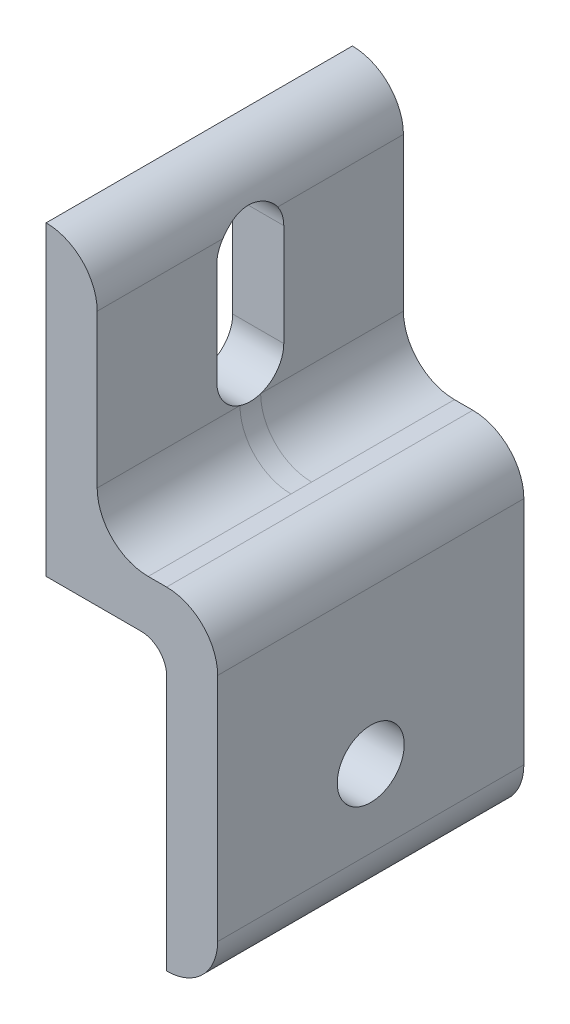
ISO-10303-21;
HEADER;
FILE_DESCRIPTION(('STEP AP214'),'2;1');
FILE_NAME('part.step','',(''),(''),'','','');
FILE_SCHEMA(('AUTOMOTIVE_DESIGN { 1 0 10303 214 1 1 1 1 }'));
ENDSEC;
DATA;
#1=APPLICATION_CONTEXT('core data for automotive mechanical design processes');
#2=APPLICATION_PROTOCOL_DEFINITION('international standard','automotive_design',2000,#1);
#3=PRODUCT_CONTEXT('',#1,'mechanical');
#4=PRODUCT('Part','Part','',(#3));
#5=PRODUCT_RELATED_PRODUCT_CATEGORY('part','',(#4));
#6=PRODUCT_DEFINITION_FORMATION('','',#4);
#7=PRODUCT_DEFINITION_CONTEXT('part definition',#1,'design');
#8=PRODUCT_DEFINITION('design','',#6,#7);
#9=PRODUCT_DEFINITION_SHAPE('','',#8);
#10=(LENGTH_UNIT() NAMED_UNIT(*) SI_UNIT(.MILLI.,.METRE.));
#11=(NAMED_UNIT(*) PLANE_ANGLE_UNIT() SI_UNIT($,.RADIAN.));
#12=(NAMED_UNIT(*) SI_UNIT($,.STERADIAN.) SOLID_ANGLE_UNIT());
#13=UNCERTAINTY_MEASURE_WITH_UNIT(LENGTH_MEASURE(1.E-05),#10,'distance_accuracy_value','');
#14=(GEOMETRIC_REPRESENTATION_CONTEXT(3) GLOBAL_UNCERTAINTY_ASSIGNED_CONTEXT((#13)) GLOBAL_UNIT_ASSIGNED_CONTEXT((#10,
#11,#12)) REPRESENTATION_CONTEXT('',''));
#15=CARTESIAN_POINT('',(0.,0.,0.));
#16=DIRECTION('',(0.,0.,1.));
#17=DIRECTION('',(1.,0.,0.));
#18=AXIS2_PLACEMENT_3D('',#15,#16,#17);
#19=CARTESIAN_POINT('',(6.35,6.35,-19.05));
#20=DIRECTION('',(1.,0.,0.));
#21=DIRECTION('',(0.,1.,0.));
#22=AXIS2_PLACEMENT_3D('',#19,#20,#21);
#23=PLANE('',#22);
#24=DIRECTION('',(0.,1.,0.));
#25=VECTOR('',#24,1.);
#26=CARTESIAN_POINT('',(6.35,6.35,19.05));
#27=LINE('',#26,#25);
#28=CARTESIAN_POINT('',(6.34999999999981,12.6999999999998,19.05));
#29=VERTEX_POINT('',#28);
#30=CARTESIAN_POINT('',(6.34999999999923,31.7500000000008,19.05));
#31=VERTEX_POINT('',#30);
#32=EDGE_CURVE('E311',#29,#31,#27,.T.);
#33=ORIENTED_EDGE('',*,*,#32,.F.);
#34=DIRECTION('',(0.,0.,1.));
#35=VECTOR('',#34,1.);
#36=CARTESIAN_POINT('',(6.34999999999981,12.6999999999998,-19.05));
#37=LINE('',#36,#35);
#38=CARTESIAN_POINT('',(6.34999999999981,12.6999999999998,1.28514964109184));
#39=VERTEX_POINT('',#38);
#40=EDGE_CURVE('E275',#29,#39,#37,.F.);
#41=ORIENTED_EDGE('',*,*,#40,.T.);
#42=CARTESIAN_POINT('',(6.34999999999969,16.6624,0.));
#43=DIRECTION('',(1.,0.,0.));
#44=DIRECTION('',(0.,1.,0.));
#45=AXIS2_PLACEMENT_3D('',#42,#43,#44);
#46=CIRCLE('',#45,4.1656);
#47=CARTESIAN_POINT('',(6.34999999999956,16.6624,4.1656));
#48=VERTEX_POINT('',#47);
#49=EDGE_CURVE('E208',#48,#39,#46,.T.);
#50=ORIENTED_EDGE('',*,*,#49,.F.);
#51=DIRECTION('',(0.,-1.,0.));
#52=VECTOR('',#51,1.);
#53=CARTESIAN_POINT('',(6.35,6.35,4.1656));
#54=LINE('',#53,#52);
#55=CARTESIAN_POINT('',(6.3499999999995,29.3624,4.1656));
#56=VERTEX_POINT('',#55);
#57=EDGE_CURVE('E210',#56,#48,#54,.T.);
#58=ORIENTED_EDGE('',*,*,#57,.F.);
#59=CARTESIAN_POINT('',(6.34999999999931,29.3624,0.));
#60=DIRECTION('',(1.,0.,0.));
#61=DIRECTION('',(0.,1.,0.));
#62=AXIS2_PLACEMENT_3D('',#59,#60,#61);
#63=CIRCLE('',#62,4.1656);
#64=CARTESIAN_POINT('',(6.34999999999923,31.7500000000008,3.41344248523339));
#65=VERTEX_POINT('',#64);
#66=EDGE_CURVE('E213',#65,#56,#63,.T.);
#67=ORIENTED_EDGE('',*,*,#66,.F.);
#68=DIRECTION('',(0.,0.,1.));
#69=VECTOR('',#68,1.);
#70=CARTESIAN_POINT('',(6.34999999999923,31.7500000000008,-19.05));
#71=LINE('',#70,#69);
#72=EDGE_CURVE('E316',#65,#31,#71,.T.);
#73=ORIENTED_EDGE('',*,*,#72,.T.);
#74=EDGE_LOOP('',(#33,#41,#50,#58,#67,#73));
#75=FACE_BOUND('',#74,.T.);
#76=ADVANCED_FACE('F35',(#75),#23,.T.);
#77=CARTESIAN_POINT('',(7.554720737879E-13,31.7500000000008,-19.05));
#78=DIRECTION('',(0.,0.,1.));
#79=DIRECTION('',(1.,0.,0.));
#80=AXIS2_PLACEMENT_3D('',#77,#78,#79);
#81=CYLINDRICAL_SURFACE('',#80,6.34999999999885);
#82=CARTESIAN_POINT('',(6.34999999999961,31.7500000000008,-3.41344248523339));
#83=CARTESIAN_POINT('',(6.35000698677265,31.8446932667508,-3.34722514791223));
#84=CARTESIAN_POINT('',(6.34788207374827,31.9365866354576,-3.27706419389319));
#85=CARTESIAN_POINT('',(6.34017282213429,32.1141065609839,-3.129475834755));
#86=CARTESIAN_POINT('',(6.33459035345151,32.1997364772192,-3.05205237651806));
#87=CARTESIAN_POINT('',(6.32078001649692,32.3640307847281,-2.89061998266093));
#88=CARTESIAN_POINT('',(6.31255651902265,32.4427064126324,-2.8066220999554));
#89=CARTESIAN_POINT('',(6.29428178227989,32.5927505379065,-2.63254164969464));
#90=CARTESIAN_POINT('',(6.28423031613611,32.6641181265306,-2.54245832772853));
#91=CARTESIAN_POINT('',(6.25258336023243,32.8663864753488,-2.26423408880698));
#92=CARTESIAN_POINT('',(6.22945722099399,32.9858236420154,-2.06775333991293));
#93=CARTESIAN_POINT('',(6.1852642799647,33.1908702311093,-1.6575884079612));
#94=CARTESIAN_POINT('',(6.16419785436702,33.2764734826485,-1.44390109518595));
#95=CARTESIAN_POINT('',(6.13771746310376,33.3785428581076,-1.11207179515542));
#96=CARTESIAN_POINT('',(6.12967818858479,33.4083729998288,-0.998105509403607));
#97=CARTESIAN_POINT('',(6.11595576391769,33.45829435754,-0.767932255797356));
#98=CARTESIAN_POINT('',(6.11027177282651,33.4783890499615,-0.651726103212562));
#99=CARTESIAN_POINT('',(6.10162879542352,33.5086561908719,-0.417945350803187));
#100=CARTESIAN_POINT('',(6.09866951890125,33.5188296960774,-0.300370898067946));
#101=CARTESIAN_POINT('',(6.09566230418245,33.5291657084276,-0.064747847647642));
#102=CARTESIAN_POINT('',(6.09561426108281,33.5293285762946,0.0533007327994509));
#103=CARTESIAN_POINT('',(6.09838205483891,33.519819734026,0.284543157863951));
#104=CARTESIAN_POINT('',(6.10109078276964,33.5105158394296,0.397753354764403));
#105=CARTESIAN_POINT('',(6.10904030199108,33.4827203228084,0.622960555001431));
#106=CARTESIAN_POINT('',(6.11428196814307,33.4642255262399,0.734957125483615));
#107=CARTESIAN_POINT('',(6.13338400603815,33.3951440749273,1.06792829036276));
#108=CARTESIAN_POINT('',(6.15062405178397,33.3309534479927,1.28604727031638));
#109=CARTESIAN_POINT('',(6.19027545655594,33.1677460203903,1.70984729081007));
#110=CARTESIAN_POINT('',(6.21272072554116,33.06849851791,1.91543509364237));
#111=CARTESIAN_POINT('',(6.25722412676981,32.8378421536363,2.30764045634037));
#112=CARTESIAN_POINT('',(6.27928249677695,32.7064538427828,2.49427003066763));
#113=CARTESIAN_POINT('',(6.31319256024349,32.4429109812273,2.81004971061114));
#114=CARTESIAN_POINT('',(6.32619389665524,32.3158417595997,2.94332922009466));
#115=CARTESIAN_POINT('',(6.33999774536247,32.1126922031175,3.12995064725235));
#116=CARTESIAN_POINT('',(6.34364968631355,32.0428512687763,3.18996493563992));
#117=CARTESIAN_POINT('',(6.34865226926181,31.8992698400224,3.30529902300918));
#118=CARTESIAN_POINT('',(6.3500019227015,31.8255276845053,3.3606167957162));
#119=CARTESIAN_POINT('',(6.34999999999961,31.7500000000008,3.4134424852334));
#120=B_SPLINE_CURVE_WITH_KNOTS('',3,(#82,#83,#84,#85,#86,#87,#88,#89,#90,#91,#92,#93,#94,#95,
#96,#97,#98,#99,#100,#101,#102,#103,#104,#105,#106,#107,#108,#109,#110,#111,#112,#113,#114,#115,
#116,#117,#118,#119),.UNSPECIFIED.,.F.,.F.,(4,2,2,2,2,2,2,2,2,2,2,2,2,2,2,2,2,2,4),(0.,
0.346475819829641,0.69276442287172,1.03848286000448,1.3842442347256,2.07422002141415,
2.76432159315497,3.11818275524893,3.47191746375981,3.82561449148323,4.17929877411273,
4.51974697787677,4.86031285449645,5.54096148970148,6.22617543983945,6.91095240185648,
7.46299188104363,7.73925459619891,8.01563590336078),.UNSPECIFIED.);
#121=CARTESIAN_POINT('',(6.34999999999961,31.7500000000008,-3.41344248523339));
#122=VERTEX_POINT('',#121);
#123=EDGE_CURVE('E215',#122,#65,#120,.T.);
#124=ORIENTED_EDGE('',*,*,#123,.F.);
#125=CARTESIAN_POINT('',(6.34999999999923,31.7500000000008,-19.05));
#126=VERTEX_POINT('',#125);
#127=EDGE_CURVE('E365',#126,#122,#71,.T.);
#128=ORIENTED_EDGE('',*,*,#127,.F.);
#129=CARTESIAN_POINT('',(7.554720737879E-13,31.7500000000008,-19.05));
#130=DIRECTION('',(0.,0.,1.));
#131=DIRECTION('',(1.,0.,0.));
#132=AXIS2_PLACEMENT_3D('',#129,#130,#131);
#133=CIRCLE('',#132,6.34999999999885);
#134=CARTESIAN_POINT('',(0.,38.1,-19.05));
#135=VERTEX_POINT('',#134);
#136=EDGE_CURVE('E224',#126,#135,#133,.T.);
#137=ORIENTED_EDGE('',*,*,#136,.T.);
#138=DIRECTION('',(0.,0.,1.));
#139=VECTOR('',#138,1.);
#140=CARTESIAN_POINT('',(0.,38.1,-19.05));
#141=LINE('',#140,#139);
#142=CARTESIAN_POINT('',(0.,38.1,19.05));
#143=VERTEX_POINT('',#142);
#144=EDGE_CURVE('E338',#135,#143,#141,.T.);
#145=ORIENTED_EDGE('',*,*,#144,.T.);
#146=CARTESIAN_POINT('',(7.554720737879E-13,31.7500000000008,19.05));
#147=DIRECTION('',(0.,0.,1.));
#148=DIRECTION('',(1.,0.,0.));
#149=AXIS2_PLACEMENT_3D('',#146,#147,#148);
#150=CIRCLE('',#149,6.34999999999885);
#151=EDGE_CURVE('E347',#31,#143,#150,.T.);
#152=ORIENTED_EDGE('',*,*,#151,.F.);
#153=ORIENTED_EDGE('',*,*,#72,.F.);
#154=EDGE_LOOP('',(#124,#128,#137,#145,#152,#153));
#155=FACE_BOUND('',#154,.T.);
#156=ADVANCED_FACE('F226',(#155),#81,.T.);
#157=CARTESIAN_POINT('',(6.34999999999981,12.6999999999998,-1.28514964109184));
#158=VERTEX_POINT('',#157);
#159=CARTESIAN_POINT('',(6.34999999999969,16.6624,-4.1656));
#160=VERTEX_POINT('',#159);
#161=EDGE_CURVE('E179',#158,#160,#46,.T.);
#162=ORIENTED_EDGE('',*,*,#161,.F.);
#163=DIRECTION('',(0.,0.,1.));
#164=VECTOR('',#163,1.);
#165=CARTESIAN_POINT('',(6.34999999999981,12.6999999999998,-19.05));
#166=LINE('',#165,#164);
#167=CARTESIAN_POINT('',(6.34999999999981,12.6999999999998,-19.05));
#168=VERTEX_POINT('',#167);
#169=EDGE_CURVE('E277',#158,#168,#166,.F.);
#170=ORIENTED_EDGE('',*,*,#169,.T.);
#171=DIRECTION('',(0.,1.,0.));
#172=VECTOR('',#171,1.);
#173=CARTESIAN_POINT('',(6.35,6.35,-19.05));
#174=LINE('',#173,#172);
#175=EDGE_CURVE('E332',#168,#126,#174,.T.);
#176=ORIENTED_EDGE('',*,*,#175,.T.);
#177=ORIENTED_EDGE('',*,*,#127,.T.);
#178=CARTESIAN_POINT('',(6.3499999999995,29.3624,-4.1656));
#179=VERTEX_POINT('',#178);
#180=EDGE_CURVE('E216',#179,#122,#63,.T.);
#181=ORIENTED_EDGE('',*,*,#180,.F.);
#182=DIRECTION('',(0.,1.,0.));
#183=VECTOR('',#182,1.);
#184=CARTESIAN_POINT('',(6.35,6.35,-4.1656));
#185=LINE('',#184,#183);
#186=EDGE_CURVE('E204',#160,#179,#185,.T.);
#187=ORIENTED_EDGE('',*,*,#186,.F.);
#188=EDGE_LOOP('',(#162,#170,#176,#177,#181,#187));
#189=FACE_BOUND('',#188,.T.);
#190=ADVANCED_FACE('F245',(#189),#23,.T.);
#191=CARTESIAN_POINT('',(21.336,6.35,-19.05));
#192=DIRECTION('',(0.,1.,0.));
#193=DIRECTION('',(-1.,0.,0.));
#194=AXIS2_PLACEMENT_3D('',#191,#192,#193);
#195=PLANE('',#194);
#196=DIRECTION('',(-1.,0.,0.));
#197=VECTOR('',#196,1.);
#198=CARTESIAN_POINT('',(21.336,6.35,-19.05));
#199=LINE('',#198,#197);
#200=CARTESIAN_POINT('',(14.9859999999999,6.35,-19.05));
#201=VERTEX_POINT('',#200);
#202=CARTESIAN_POINT('',(12.6999999999998,6.35,-19.05));
#203=VERTEX_POINT('',#202);
#204=EDGE_CURVE('E339',#201,#203,#199,.T.);
#205=ORIENTED_EDGE('',*,*,#204,.T.);
#206=DIRECTION('',(0.,0.,1.));
#207=VECTOR('',#206,1.);
#208=CARTESIAN_POINT('',(12.6999999999998,6.35,19.05));
#209=LINE('',#208,#207);
#210=CARTESIAN_POINT('',(12.6999999999998,6.35,-1.28514964109184));
#211=VERTEX_POINT('',#210);
#212=EDGE_CURVE('E279',#203,#211,#209,.T.);
#213=ORIENTED_EDGE('',*,*,#212,.T.);
#214=CARTESIAN_POINT('',(6.34999999999981,12.7825911582844,1.51634650121448));
#215=CARTESIAN_POINT('',(6.26632862491329,6.35,1.51592112938595));
#216=CARTESIAN_POINT('',(12.6993808164066,6.35,1.54862573321142));
#217=CARTESIAN_POINT('',(6.34999999999981,12.7460438499055,1.42297822219657));
#218=CARTESIAN_POINT('',(6.30373358447325,6.35,1.42324142556631));
#219=CARTESIAN_POINT('',(12.6999301175916,6.35,1.43859098618352));
#220=CARTESIAN_POINT('',(6.34999999999981,12.7118732561543,1.32546159634987));
#221=CARTESIAN_POINT('',(6.33818253254726,6.35,1.32574892897827));
#222=CARTESIAN_POINT('',(12.7000676154768,6.35,1.3285560301377));
#223=CARTESIAN_POINT('',(6.34999999999981,12.649757508692,1.12338081871539));
#224=CARTESIAN_POINT('',(6.39992041604157,6.35,1.12355092554158));
#225=CARTESIAN_POINT('',(12.699868942501,6.35,1.10848703607227));
#226=CARTESIAN_POINT('',(6.34999999999981,12.6218123130322,1.01881671442197));
#227=CARTESIAN_POINT('',(6.42727527447569,6.35,1.01877854891046));
#228=CARTESIAN_POINT('',(12.6995327748318,6.35,0.998452998051461));
#229=CARTESIAN_POINT('',(6.34999999999981,12.5736238468477,0.803911183196922));
#230=CARTESIAN_POINT('',(6.47393126473167,6.35,0.803623995064673));
#231=CARTESIAN_POINT('',(12.6987367892701,6.35,0.778408554611836));
#232=CARTESIAN_POINT('',(6.34999999999981,12.5533789773158,0.693570961121905));
#233=CARTESIAN_POINT('',(6.49329219713127,6.35,0.693133957340219));
#234=CARTESIAN_POINT('',(12.6982769970827,6.35,0.668398149032816));
#235=CARTESIAN_POINT('',(6.34999999999981,12.521733090536,0.468987623280432));
#236=CARTESIAN_POINT('',(6.52334960549051,6.35,0.468555440618695));
#237=CARTESIAN_POINT('',(12.6974841728577,6.35,0.448376733300546));
#238=CARTESIAN_POINT('',(6.34999999999982,12.5103320737778,0.354744507297899));
#239=CARTESIAN_POINT('',(6.53408757953604,6.35,0.354322586680121));
#240=CARTESIAN_POINT('',(12.6971511408272,6.35,0.338365723147263));
#241=CARTESIAN_POINT('',(6.34999999999982,12.4970721291957,0.124651572304804));
#242=CARTESIAN_POINT('',(6.54654688497329,6.35,0.124511333012714));
#243=CARTESIAN_POINT('',(12.6967590722795,6.35,0.118402014234015));
#244=CARTESIAN_POINT('',(6.34999999999982,12.4952080993904,0.00880264562078104));
#245=CARTESIAN_POINT('',(6.54829121515289,6.35,0.0087679414545364));
#246=CARTESIAN_POINT('',(12.6966998892635,6.35,0.00844931576677151));
#247=CARTESIAN_POINT('',(6.34999999999982,12.501124066416,-0.222149721539175));
#248=CARTESIAN_POINT('',(6.54274228437511,6.35,-0.22184852711768));
#249=CARTESIAN_POINT('',(12.6968790131433,6.35,-0.211455791965441));
#250=CARTESIAN_POINT('',(6.34999999999982,12.5089040619553,-0.337253162114948));
#251=CARTESIAN_POINT('',(6.53544085514425,6.35,-0.336891021192604));
#252=CARTESIAN_POINT('',(12.6971173199992,6.35,-0.321408201230446));
#253=CARTESIAN_POINT('',(6.34999999999981,12.5336311632976,-0.564402893806105));
#254=CARTESIAN_POINT('',(6.51207635846747,6.35,-0.563914628171711));
#255=CARTESIAN_POINT('',(12.6977912856195,6.35,-0.541332137102234));
#256=CARTESIAN_POINT('',(6.34999999999981,12.5505799215572,-0.676448630016392));
#257=CARTESIAN_POINT('',(6.49597858599311,6.35,-0.676049595165145));
#258=CARTESIAN_POINT('',(12.6982269799561,6.35,-0.651303663581801));
#259=CARTESIAN_POINT('',(6.34999999999981,12.5926506366778,-0.895433970442579));
#260=CARTESIAN_POINT('',(6.4555834274269,6.35,-0.89521119011339));
#261=CARTESIAN_POINT('',(12.6990812319771,6.35,-0.871247152693623));
#262=CARTESIAN_POINT('',(6.34999999999981,12.6177726204386,-1.00237355785164));
#263=CARTESIAN_POINT('',(6.43123340858252,6.35,-1.00236159718776));
#264=CARTESIAN_POINT('',(12.6994997896052,6.35,-0.981219115326123));
#265=CARTESIAN_POINT('',(6.34999999999981,12.674887233127,-1.20977882815034));
#266=CARTESIAN_POINT('',(6.37507779983789,6.35,-1.21000601762721));
#267=CARTESIAN_POINT('',(12.7000121745756,6.35,-1.20137044415654));
#268=CARTESIAN_POINT('',(6.34999999999981,12.7068926630394,-1.31023198956529));
#269=CARTESIAN_POINT('',(6.34319425668443,6.35,-1.31057006414529));
#270=CARTESIAN_POINT('',(12.7001053912475,6.35,-1.3115498124088));
#271=CARTESIAN_POINT('',(6.34999999999981,12.7762038385946,-1.50340972246146));
#272=CARTESIAN_POINT('',(6.27297109201109,6.35,-1.50340495234299));
#273=CARTESIAN_POINT('',(12.6995877551003,6.35,-1.53190733233023));
#274=CARTESIAN_POINT('',(6.34999999999981,12.8135095643092,-1.59613432299843));
#275=CARTESIAN_POINT('',(6.23456454219481,6.35,-1.59571590677697));
#276=CARTESIAN_POINT('',(12.6989769049283,6.35,-1.64208548400242));
#277=CARTESIAN_POINT('',(6.3499999999998,12.8918551209836,-1.77330167156835));
#278=CARTESIAN_POINT('',(6.15239601143431,6.35,-1.7709470114761));
#279=CARTESIAN_POINT('',(12.6966332569151,6.35,-1.86238765174881));
#280=CARTESIAN_POINT('',(6.3499999999998,12.9328934663137,-1.85774768701602));
#281=CARTESIAN_POINT('',(6.1085744067042,6.35,-1.85387025805082));
#282=CARTESIAN_POINT('',(12.6949009037811,6.35,-1.97251167197356));
#283=CARTESIAN_POINT('',(6.3499999999998,13.0172862796494,-2.01831597971602));
#284=CARTESIAN_POINT('',(6.01670214868045,6.35,-2.00963984732044));
#285=CARTESIAN_POINT('',(12.6898806061885,6.35,-2.19272372836852));
#286=CARTESIAN_POINT('',(6.3499999999998,13.0606406940506,-2.0944384494888));
#287=CARTESIAN_POINT('',(5.96860097359892,6.35,-2.08245160296339));
#288=CARTESIAN_POINT('',(12.6865926977187,6.35,-2.30281176531226));
#289=CARTESIAN_POINT('',(6.3499999999998,13.1484681632539,-2.23867048215067));
#290=CARTESIAN_POINT('',(5.86927546761155,6.35,-2.21763052929145));
#291=CARTESIAN_POINT('',(12.678026595466,6.35,-2.52300500595322));
#292=CARTESIAN_POINT('',(6.3499999999998,13.1929421209398,-2.30677330860368));
#293=CARTESIAN_POINT('',(5.81801265020767,6.35,-2.27992827885136));
#294=CARTESIAN_POINT('',(12.6727467438955,6.35,-2.6331101473803));
#295=CARTESIAN_POINT('',(6.34999999999979,13.2819635926915,-2.4353614117415));
#296=CARTESIAN_POINT('',(5.71352977601585,6.35,-2.39383531103836));
#297=CARTESIAN_POINT('',(12.6597834353274,6.35,-2.85317440845309));
#298=CARTESIAN_POINT('',(6.34999999999979,13.326511101881,-2.49584717437711));
#299=CARTESIAN_POINT('',(5.66028934069509,6.35,-2.44536869251902));
#300=CARTESIAN_POINT('',(12.6521001317734,6.35,-2.96313353697078));
#301=CARTESIAN_POINT('',(6.34999999999979,13.4149571647497,-2.60989829398067));
#302=CARTESIAN_POINT('',(5.55285419913103,6.35,-2.53786515118848));
#303=CARTESIAN_POINT('',(12.6339263743875,6.35,-3.18299631570249));
#304=CARTESIAN_POINT('',(6.34999999999979,13.4588546013959,-2.66345274174514));
#305=CARTESIAN_POINT('',(5.49865383436361,6.35,-2.57872568943871));
#306=CARTESIAN_POINT('',(12.6234315733431,6.35,-3.29289961366784));
#307=CARTESIAN_POINT('',(6.34999999999979,13.5453945880096,-2.76421073952007));
#308=CARTESIAN_POINT('',(5.39036002432522,6.35,-2.65003623275056));
#309=CARTESIAN_POINT('',(12.5992895532702,6.35,-3.51238505650818));
#310=CARTESIAN_POINT('',(6.34999999999978,13.5880368266204,-2.81141272397782));
#311=CARTESIAN_POINT('',(5.33627515419178,6.35,-2.68039673184282));
#312=CARTESIAN_POINT('',(12.5856415593863,6.35,-3.62196711572913));
#313=CARTESIAN_POINT('',(6.34999999999978,13.6297729795811,-2.85576552171659));
#314=CARTESIAN_POINT('',(5.28299397873088,6.35,-2.70557592746875));
#315=CARTESIAN_POINT('',(12.570244075104,6.35,-3.73131440817127));
#316=(BOUNDED_SURFACE() B_SPLINE_SURFACE(3,2,((#214,#215,#216),(#217,#218,#219),(#220,#221,
#222),(#223,#224,#225),(#226,#227,#228),(#229,#230,#231),(#232,#233,#234),(#235,#236,#237),
(#238,#239,#240),(#241,#242,#243),(#244,#245,#246),(#247,#248,#249),(#250,#251,#252),(#253,#254,
#255),(#256,#257,#258),(#259,#260,#261),(#262,#263,#264),(#265,#266,#267),(#268,#269,#270),
(#271,#272,#273),(#274,#275,#276),(#277,#278,#279),(#280,#281,#282),(#283,#284,#285),(#286,#287,
#288),(#289,#290,#291),(#292,#293,#294),(#295,#296,#297),(#298,#299,#300),(#301,#302,#303),
(#304,#305,#306),(#307,#308,#309),(#310,#311,#312),(#313,#314,#315)),.UNSPECIFIED.,.F.,.F.,
.F.) B_SPLINE_SURFACE_WITH_KNOTS((4,2,2,2,2,2,2,2,2,2,2,2,2,2,2,2,4),(3,3),(0.,0.33010509357344,
0.660207962726059,0.990242247061985,1.32027654966965,1.65013427606385,1.97999195828016,
2.30990910949918,2.63982734656213,2.97036451355756,3.30090043783257,3.63130537558041,
3.96170266957026,4.29237554430252,4.62302731218166,4.95419332340579,5.28544080099889),(0.,1.),
.UNSPECIFIED.) GEOMETRIC_REPRESENTATION_ITEM() RATIONAL_B_SPLINE_SURFACE(((1.,0.702493244942758,
1.),(1.,0.704541582431967,1.),(1.,0.706447527093296,1.),(1.,0.709900734894976,1.),(1.,
0.711448000452224,1.),(1.,0.714109707240024,1.),(1.,0.715224238330835,1.),(1.,0.71696410608536,
1.),(1.,0.717589442721992,1.),(1.,0.71831658127861,1.),(1.,0.718418663123138,1.),(1.,
0.718094385083623,1.),(1.,0.717668025270354,1.),(1.,0.716310240014892,1.),(1.,0.715378723529865,
1.),(1.,0.713059630954266,1.),(1.,0.71167205336269,1.),(1.,0.708505386266038,1.),(1.,
0.706725567164131,1.),(1.,0.702853780283404,1.),(1.,0.700761813678195,1.),(1.,0.696346297094369,
1.),(1.,0.694022839217366,1.),(1.,0.689218831757292,1.),(1.,0.686738285809705,1.),(1.,
0.681684632122047,1.),(1.,0.679111448902933,1.),(1.,0.673930867384015,1.),(1.,0.671323471278644,
1.),(1.,0.666116304871042,1.),(1.,0.663516552735482,1.),(1.,0.658361782219791,1.),(1.,
0.655806775001424,1.),(1.,0.653291304983345,1.))) REPRESENTATION_ITEM('') SURFACE());
#317=CARTESIAN_POINT('',(12.570244075104,6.35,-3.73131440817127));
#318=CARTESIAN_POINT('',(12.5856415593863,6.35,-3.62196711572913));
#319=CARTESIAN_POINT('',(12.5992895532702,6.35,-3.51238505650818));
#320=CARTESIAN_POINT('',(12.6234315733431,6.35,-3.29289961366784));
#321=CARTESIAN_POINT('',(12.6339263743875,6.35,-3.18299631570249));
#322=CARTESIAN_POINT('',(12.6521001317734,6.35,-2.96313353697078));
#323=CARTESIAN_POINT('',(12.6597834353274,6.35,-2.85317440845309));
#324=CARTESIAN_POINT('',(12.6727467438955,6.35,-2.6331101473803));
#325=CARTESIAN_POINT('',(12.678026595466,6.35,-2.52300500595322));
#326=CARTESIAN_POINT('',(12.6865926977187,6.35,-2.30281176531226));
#327=CARTESIAN_POINT('',(12.6898806061885,6.35,-2.19272372836852));
#328=CARTESIAN_POINT('',(12.6949009037811,6.35,-1.97251167197356));
#329=CARTESIAN_POINT('',(12.6966332569151,6.35,-1.86238765174881));
#330=CARTESIAN_POINT('',(12.6989769049283,6.35,-1.64208548400242));
#331=CARTESIAN_POINT('',(12.6995877551003,6.35,-1.53190733233023));
#332=CARTESIAN_POINT('',(12.7001053912475,6.35,-1.3115498124088));
#333=CARTESIAN_POINT('',(12.7000121745756,6.35,-1.20137044415654));
#334=CARTESIAN_POINT('',(12.6994997896052,6.35,-0.981219115326123));
#335=CARTESIAN_POINT('',(12.6990812319771,6.35,-0.871247152693623));
#336=CARTESIAN_POINT('',(12.6982269799561,6.35,-0.651303663581801));
#337=CARTESIAN_POINT('',(12.6977912856195,6.35,-0.541332137102235));
#338=CARTESIAN_POINT('',(12.6971173199992,6.35,-0.321408201230446));
#339=CARTESIAN_POINT('',(12.6968790131433,6.35,-0.211455791965441));
#340=CARTESIAN_POINT('',(12.6966998892635,6.35,0.00844931576677144));
#341=CARTESIAN_POINT('',(12.6967590722795,6.35,0.118402014234015));
#342=CARTESIAN_POINT('',(12.6971511408272,6.35,0.338365723147263));
#343=CARTESIAN_POINT('',(12.6974841728577,6.35,0.448376733300547));
#344=CARTESIAN_POINT('',(12.6982769970827,6.35,0.668398149032817));
#345=CARTESIAN_POINT('',(12.6987367892701,6.35,0.778408554611836));
#346=CARTESIAN_POINT('',(12.6995327748318,6.35,0.998452998051461));
#347=CARTESIAN_POINT('',(12.699868942501,6.35,1.10848703607227));
#348=CARTESIAN_POINT('',(12.7000676154768,6.35,1.3285560301377));
#349=CARTESIAN_POINT('',(12.6999301175916,6.35,1.43859098618352));
#350=CARTESIAN_POINT('',(12.6993808164066,6.35,1.54862573321142));
#351=B_SPLINE_CURVE_WITH_KNOTS('',3,(#317,#318,#319,#320,#321,#322,#323,#324,#325,#326,#327,
#328,#329,#330,#331,#332,#333,#334,#335,#336,#337,#338,#339,#340,#341,#342,#343,#344,#345,#346,
#347,#348,#349,#350),.UNSPECIFIED.,.F.,.F.,(4,2,2,2,2,2,2,2,2,2,2,2,2,2,2,2,4),(0.,
0.3312474775931,0.662413488817227,0.99306525669637,1.32373813142863,1.65413542541848,
1.98454036316633,2.31507628744134,2.64561345443677,2.97553169149972,3.30544884271873,
3.63530652493504,3.96516425132925,4.29519855393691,4.62523283827283,4.95533570742545,
5.28544080099889),.UNSPECIFIED.);
#352=CARTESIAN_POINT('',(12.6999999999998,6.35,1.28514964109184));
#353=VERTEX_POINT('',#352);
#354=EDGE_CURVE('E282',#211,#353,#351,.T.);
#355=ORIENTED_EDGE('',*,*,#354,.T.);
#356=DIRECTION('',(0.,0.,1.));
#357=VECTOR('',#356,1.);
#358=CARTESIAN_POINT('',(12.6999999999998,6.35,19.05));
#359=LINE('',#358,#357);
#360=CARTESIAN_POINT('',(12.6999999999998,6.35,19.05));
#361=VERTEX_POINT('',#360);
#362=EDGE_CURVE('E289',#353,#361,#359,.T.);
#363=ORIENTED_EDGE('',*,*,#362,.T.);
#364=DIRECTION('',(-1.,0.,0.));
#365=VECTOR('',#364,1.);
#366=CARTESIAN_POINT('',(21.336,6.35,19.05));
#367=LINE('',#366,#365);
#368=CARTESIAN_POINT('',(14.9859999999999,6.35,19.05));
#369=VERTEX_POINT('',#368);
#370=EDGE_CURVE('E319',#369,#361,#367,.T.);
#371=ORIENTED_EDGE('',*,*,#370,.F.);
#372=DIRECTION('',(0.,0.,1.));
#373=VECTOR('',#372,1.);
#374=CARTESIAN_POINT('',(14.9859999999999,6.35,-19.05));
#375=LINE('',#374,#373);
#376=EDGE_CURVE('E381',#369,#201,#375,.F.);
#377=ORIENTED_EDGE('',*,*,#376,.T.);
#378=EDGE_LOOP('',(#205,#213,#355,#363,#371,#377));
#379=FACE_BOUND('',#378,.T.);
#380=ADVANCED_FACE('F249',(#379),#195,.T.);
#381=CARTESIAN_POINT('',(21.3359999999992,-28.6766000000015,-19.05));
#382=DIRECTION('',(1.,0.,0.));
#383=DIRECTION('',(0.,1.,0.));
#384=AXIS2_PLACEMENT_3D('',#381,#382,#383);
#385=PLANE('',#384);
#386=CARTESIAN_POINT('',(21.3360000000007,-19.05,0.));
#387=DIRECTION('',(-1.,0.,0.));
#388=DIRECTION('',(0.,0.,1.));
#389=AXIS2_PLACEMENT_3D('',#386,#387,#388);
#390=CIRCLE('',#389,4.16559999999999);
#391=CARTESIAN_POINT('',(21.3360000000007,-19.05,4.16559999999999));
#392=VERTEX_POINT('',#391);
#393=EDGE_CURVE('E403',#392,#392,#390,.T.);
#394=ORIENTED_EDGE('',*,*,#393,.T.);
#395=EDGE_LOOP('',(#394));
#396=FACE_BOUND('',#395,.T.);
#397=DIRECTION('',(0.,1.,0.));
#398=VECTOR('',#397,1.);
#399=CARTESIAN_POINT('',(21.3359999999992,-28.6766000000015,-19.05));
#400=LINE('',#399,#398);
#401=CARTESIAN_POINT('',(21.3359999999989,-28.6766000000015,-19.05));
#402=VERTEX_POINT('',#401);
#403=CARTESIAN_POINT('',(21.3359999999999,-1.35308431126191E-13,-19.05));
#404=VERTEX_POINT('',#403);
#405=EDGE_CURVE('E343',#402,#404,#400,.T.);
#406=ORIENTED_EDGE('',*,*,#405,.T.);
#407=DIRECTION('',(0.,0.,1.));
#408=VECTOR('',#407,1.);
#409=CARTESIAN_POINT('',(21.3359999999999,-1.35308431126191E-13,-19.05));
#410=LINE('',#409,#408);
#411=CARTESIAN_POINT('',(21.3359999999999,-1.35308431126191E-13,19.05));
#412=VERTEX_POINT('',#411);
#413=EDGE_CURVE('E273',#404,#412,#410,.T.);
#414=ORIENTED_EDGE('',*,*,#413,.T.);
#415=DIRECTION('',(0.,1.,0.));
#416=VECTOR('',#415,1.);
#417=CARTESIAN_POINT('',(21.3359999999992,-28.6766000000015,19.05));
#418=LINE('',#417,#416);
#419=CARTESIAN_POINT('',(21.3359999999989,-28.6766000000015,19.05));
#420=VERTEX_POINT('',#419);
#421=EDGE_CURVE('E360',#420,#412,#418,.T.);
#422=ORIENTED_EDGE('',*,*,#421,.F.);
#423=DIRECTION('',(0.,0.,1.));
#424=VECTOR('',#423,1.);
#425=CARTESIAN_POINT('',(21.3359999999989,-28.6766000000015,-19.05));
#426=LINE('',#425,#424);
#427=EDGE_CURVE('E368',#402,#420,#426,.T.);
#428=ORIENTED_EDGE('',*,*,#427,.F.);
#429=EDGE_LOOP('',(#406,#414,#422,#428));
#430=FACE_BOUND('',#429,.T.);
#431=ADVANCED_FACE('F387',(#396,#430),#385,.T.);
#432=CARTESIAN_POINT('',(14.986,-28.6766000000015,-19.05));
#433=DIRECTION('',(0.,0.,1.));
#434=DIRECTION('',(1.,0.,0.));
#435=AXIS2_PLACEMENT_3D('',#432,#433,#434);
#436=CYLINDRICAL_SURFACE('',#435,6.34999999999886);
#437=CARTESIAN_POINT('',(14.986,-28.6766000000015,19.05));
#438=DIRECTION('',(0.,0.,1.));
#439=DIRECTION('',(1.,0.,0.));
#440=AXIS2_PLACEMENT_3D('',#437,#438,#439);
#441=CIRCLE('',#440,6.34999999999886);
#442=CARTESIAN_POINT('',(14.986,-35.0266,19.05));
#443=VERTEX_POINT('',#442);
#444=EDGE_CURVE('E357',#443,#420,#441,.T.);
#445=ORIENTED_EDGE('',*,*,#444,.F.);
#446=DIRECTION('',(0.,0.,1.));
#447=VECTOR('',#446,1.);
#448=CARTESIAN_POINT('',(14.986,-35.0266,-19.05));
#449=LINE('',#448,#447);
#450=CARTESIAN_POINT('',(14.986,-35.0266,-19.05));
#451=VERTEX_POINT('',#450);
#452=EDGE_CURVE('E370',#451,#443,#449,.T.);
#453=ORIENTED_EDGE('',*,*,#452,.F.);
#454=CARTESIAN_POINT('',(14.986,-28.6766000000015,-19.05));
#455=DIRECTION('',(0.,0.,1.));
#456=DIRECTION('',(1.,0.,0.));
#457=AXIS2_PLACEMENT_3D('',#454,#455,#456);
#458=CIRCLE('',#457,6.34999999999886);
#459=EDGE_CURVE('E390',#451,#402,#458,.T.);
#460=ORIENTED_EDGE('',*,*,#459,.T.);
#461=ORIENTED_EDGE('',*,*,#427,.T.);
#462=EDGE_LOOP('',(#445,#453,#460,#461));
#463=FACE_BOUND('',#462,.T.);
#464=ADVANCED_FACE('F416',(#463),#436,.T.);
#465=CARTESIAN_POINT('',(14.986,0.,-19.05));
#466=DIRECTION('',(-1.,0.,0.));
#467=DIRECTION('',(0.,0.,1.));
#468=AXIS2_PLACEMENT_3D('',#465,#466,#467);
#469=PLANE('',#468);
#470=CARTESIAN_POINT('',(14.986,-19.05,0.));
#471=DIRECTION('',(-1.,0.,0.));
#472=DIRECTION('',(0.,0.,1.));
#473=AXIS2_PLACEMENT_3D('',#470,#471,#472);
#474=CIRCLE('',#473,4.16559999999999);
#475=CARTESIAN_POINT('',(14.986,-19.05,4.16559999999999));
#476=VERTEX_POINT('',#475);
#477=EDGE_CURVE('E267',#476,#476,#474,.T.);
#478=ORIENTED_EDGE('',*,*,#477,.F.);
#479=EDGE_LOOP('',(#478));
#480=FACE_BOUND('',#479,.T.);
#481=DIRECTION('',(0.,-1.,0.));
#482=VECTOR('',#481,1.);
#483=CARTESIAN_POINT('',(14.986,0.,19.05));
#484=LINE('',#483,#482);
#485=CARTESIAN_POINT('',(14.986,-3.175,19.05));
#486=VERTEX_POINT('',#485);
#487=EDGE_CURVE('E355',#486,#443,#484,.T.);
#488=ORIENTED_EDGE('',*,*,#487,.F.);
#489=DIRECTION('',(0.,0.,1.));
#490=VECTOR('',#489,1.);
#491=CARTESIAN_POINT('',(14.986,-3.175,-19.05));
#492=LINE('',#491,#490);
#493=CARTESIAN_POINT('',(14.986,-3.175,-19.05));
#494=VERTEX_POINT('',#493);
#495=EDGE_CURVE('E376',#486,#494,#492,.F.);
#496=ORIENTED_EDGE('',*,*,#495,.T.);
#497=DIRECTION('',(0.,-1.,0.));
#498=VECTOR('',#497,1.);
#499=CARTESIAN_POINT('',(14.986,0.,-19.05));
#500=LINE('',#499,#498);
#501=EDGE_CURVE('E391',#494,#451,#500,.T.);
#502=ORIENTED_EDGE('',*,*,#501,.T.);
#503=ORIENTED_EDGE('',*,*,#452,.T.);
#504=EDGE_LOOP('',(#488,#496,#502,#503));
#505=FACE_BOUND('',#504,.T.);
#506=ADVANCED_FACE('F412',(#480,#505),#469,.T.);
#507=CARTESIAN_POINT('',(0.,0.,-19.05));
#508=DIRECTION('',(0.,-1.,0.));
#509=DIRECTION('',(0.,0.,-1.));
#510=AXIS2_PLACEMENT_3D('',#507,#508,#509);
#511=PLANE('',#510);
#512=DIRECTION('',(1.,0.,0.));
#513=VECTOR('',#512,1.);
#514=CARTESIAN_POINT('',(0.,0.,-19.05));
#515=LINE('',#514,#513);
#516=CARTESIAN_POINT('',(0.,0.,-19.05));
#517=VERTEX_POINT('',#516);
#518=CARTESIAN_POINT('',(11.811,0.,-19.05));
#519=VERTEX_POINT('',#518);
#520=EDGE_CURVE('E395',#517,#519,#515,.T.);
#521=ORIENTED_EDGE('',*,*,#520,.T.);
#522=DIRECTION('',(0.,0.,1.));
#523=VECTOR('',#522,1.);
#524=CARTESIAN_POINT('',(11.811,0.,19.05));
#525=LINE('',#524,#523);
#526=CARTESIAN_POINT('',(11.811,0.,19.05));
#527=VERTEX_POINT('',#526);
#528=EDGE_CURVE('E367',#519,#527,#525,.T.);
#529=ORIENTED_EDGE('',*,*,#528,.T.);
#530=DIRECTION('',(1.,0.,0.));
#531=VECTOR('',#530,1.);
#532=CARTESIAN_POINT('',(0.,0.,19.05));
#533=LINE('',#532,#531);
#534=CARTESIAN_POINT('',(0.,0.,19.05));
#535=VERTEX_POINT('',#534);
#536=EDGE_CURVE('E352',#535,#527,#533,.T.);
#537=ORIENTED_EDGE('',*,*,#536,.F.);
#538=DIRECTION('',(0.,0.,1.));
#539=VECTOR('',#538,1.);
#540=CARTESIAN_POINT('',(0.,0.,-19.05));
#541=LINE('',#540,#539);
#542=EDGE_CURVE('E341',#517,#535,#541,.T.);
#543=ORIENTED_EDGE('',*,*,#542,.F.);
#544=EDGE_LOOP('',(#521,#529,#537,#543));
#545=FACE_BOUND('',#544,.T.);
#546=ADVANCED_FACE('F415',(#545),#511,.T.);
#547=CARTESIAN_POINT('',(0.,38.1,-19.05));
#548=DIRECTION('',(-1.,0.,0.));
#549=DIRECTION('',(0.,0.,1.));
#550=AXIS2_PLACEMENT_3D('',#547,#548,#549);
#551=PLANE('',#550);
#552=CARTESIAN_POINT('',(0.,29.3624,0.));
#553=DIRECTION('',(-1.,0.,0.));
#554=DIRECTION('',(0.,0.,1.));
#555=AXIS2_PLACEMENT_3D('',#552,#553,#554);
#556=CIRCLE('',#555,4.1656);
#557=CARTESIAN_POINT('',(0.,29.3624,4.1656));
#558=VERTEX_POINT('',#557);
#559=CARTESIAN_POINT('',(0.,29.3624,-4.1656));
#560=VERTEX_POINT('',#559);
#561=EDGE_CURVE('E192',#558,#560,#556,.T.);
#562=ORIENTED_EDGE('',*,*,#561,.F.);
#563=DIRECTION('',(0.,1.,0.));
#564=VECTOR('',#563,1.);
#565=CARTESIAN_POINT('',(0.,16.6624,4.1656));
#566=LINE('',#565,#564);
#567=CARTESIAN_POINT('',(0.,16.6624,4.1656));
#568=VERTEX_POINT('',#567);
#569=EDGE_CURVE('E197',#568,#558,#566,.T.);
#570=ORIENTED_EDGE('',*,*,#569,.F.);
#571=CARTESIAN_POINT('',(0.,16.6624,0.));
#572=DIRECTION('',(-1.,0.,0.));
#573=DIRECTION('',(0.,0.,1.));
#574=AXIS2_PLACEMENT_3D('',#571,#572,#573);
#575=CIRCLE('',#574,4.1656);
#576=CARTESIAN_POINT('',(0.,16.6624,-4.1656));
#577=VERTEX_POINT('',#576);
#578=EDGE_CURVE('E176',#577,#568,#575,.T.);
#579=ORIENTED_EDGE('',*,*,#578,.F.);
#580=DIRECTION('',(0.,-1.,0.));
#581=VECTOR('',#580,1.);
#582=CARTESIAN_POINT('',(0.,29.3624,-4.1656));
#583=LINE('',#582,#581);
#584=EDGE_CURVE('E187',#560,#577,#583,.T.);
#585=ORIENTED_EDGE('',*,*,#584,.F.);
#586=EDGE_LOOP('',(#562,#570,#579,#585));
#587=FACE_BOUND('',#586,.T.);
#588=DIRECTION('',(0.,-1.,0.));
#589=VECTOR('',#588,1.);
#590=CARTESIAN_POINT('',(0.,38.1,19.05));
#591=LINE('',#590,#589);
#592=EDGE_CURVE('E349',#143,#535,#591,.T.);
#593=ORIENTED_EDGE('',*,*,#592,.F.);
#594=ORIENTED_EDGE('',*,*,#144,.F.);
#595=DIRECTION('',(0.,-1.,0.));
#596=VECTOR('',#595,1.);
#597=CARTESIAN_POINT('',(0.,38.1,-19.05));
#598=LINE('',#597,#596);
#599=EDGE_CURVE('E397',#135,#517,#598,.T.);
#600=ORIENTED_EDGE('',*,*,#599,.T.);
#601=ORIENTED_EDGE('',*,*,#542,.T.);
#602=EDGE_LOOP('',(#593,#594,#600,#601));
#603=FACE_BOUND('',#602,.T.);
#604=ADVANCED_FACE('F194',(#587,#603),#551,.T.);
#605=CARTESIAN_POINT('',(7.554720737879E-13,31.7500000000008,-19.05));
#606=DIRECTION('',(0.,0.,1.));
#607=DIRECTION('',(1.,0.,0.));
#608=AXIS2_PLACEMENT_3D('',#605,#606,#607);
#609=PLANE('',#608);
#610=ORIENTED_EDGE('',*,*,#204,.F.);
#611=CARTESIAN_POINT('',(14.9859999999999,0.,-19.05));
#612=DIRECTION('',(0.,0.,1.));
#613=DIRECTION('',(1.,0.,0.));
#614=AXIS2_PLACEMENT_3D('',#611,#612,#613);
#615=CIRCLE('',#614,6.35);
#616=EDGE_CURVE('E58',#201,#404,#615,.F.);
#617=ORIENTED_EDGE('',*,*,#616,.T.);
#618=ORIENTED_EDGE('',*,*,#405,.F.);
#619=ORIENTED_EDGE('',*,*,#459,.F.);
#620=ORIENTED_EDGE('',*,*,#501,.F.);
#621=CARTESIAN_POINT('',(11.811,-3.175,-19.05));
#622=DIRECTION('',(0.,0.,1.));
#623=DIRECTION('',(1.,0.,0.));
#624=AXIS2_PLACEMENT_3D('',#621,#622,#623);
#625=CIRCLE('',#624,3.175);
#626=EDGE_CURVE('E380',#494,#519,#625,.T.);
#627=ORIENTED_EDGE('',*,*,#626,.T.);
#628=ORIENTED_EDGE('',*,*,#520,.F.);
#629=ORIENTED_EDGE('',*,*,#599,.F.);
#630=ORIENTED_EDGE('',*,*,#136,.F.);
#631=ORIENTED_EDGE('',*,*,#175,.F.);
#632=CARTESIAN_POINT('',(12.6999999999998,12.7,-19.05));
#633=DIRECTION('',(0.,0.,1.));
#634=DIRECTION('',(1.,0.,0.));
#635=AXIS2_PLACEMENT_3D('',#632,#633,#634);
#636=CIRCLE('',#635,6.35);
#637=EDGE_CURVE('E11',#168,#203,#636,.T.);
#638=ORIENTED_EDGE('',*,*,#637,.T.);
#639=EDGE_LOOP('',(#610,#617,#618,#619,#620,#627,#628,#629,#630,#631,#638));
#640=FACE_BOUND('',#639,.T.);
#641=ADVANCED_FACE('F239',(#640),#609,.F.);
#642=CARTESIAN_POINT('',(7.554720737879E-13,31.7500000000008,19.05));
#643=DIRECTION('',(0.,0.,1.));
#644=DIRECTION('',(1.,0.,0.));
#645=AXIS2_PLACEMENT_3D('',#642,#643,#644);
#646=PLANE('',#645);
#647=ORIENTED_EDGE('',*,*,#421,.T.);
#648=CARTESIAN_POINT('',(14.9859999999999,0.,19.05));
#649=DIRECTION('',(0.,0.,1.));
#650=DIRECTION('',(1.,0.,0.));
#651=AXIS2_PLACEMENT_3D('',#648,#649,#650);
#652=CIRCLE('',#651,6.35);
#653=EDGE_CURVE('E66',#412,#369,#652,.T.);
#654=ORIENTED_EDGE('',*,*,#653,.T.);
#655=ORIENTED_EDGE('',*,*,#370,.T.);
#656=CARTESIAN_POINT('',(12.6999999999998,12.7,19.05));
#657=DIRECTION('',(0.,0.,1.));
#658=DIRECTION('',(1.,0.,0.));
#659=AXIS2_PLACEMENT_3D('',#656,#657,#658);
#660=CIRCLE('',#659,6.35);
#661=EDGE_CURVE('E50',#361,#29,#660,.F.);
#662=ORIENTED_EDGE('',*,*,#661,.T.);
#663=ORIENTED_EDGE('',*,*,#32,.T.);
#664=ORIENTED_EDGE('',*,*,#151,.T.);
#665=ORIENTED_EDGE('',*,*,#592,.T.);
#666=ORIENTED_EDGE('',*,*,#536,.T.);
#667=CARTESIAN_POINT('',(11.811,-3.175,19.05));
#668=DIRECTION('',(0.,0.,1.));
#669=DIRECTION('',(1.,0.,0.));
#670=AXIS2_PLACEMENT_3D('',#667,#668,#669);
#671=CIRCLE('',#670,3.175);
#672=EDGE_CURVE('E378',#527,#486,#671,.F.);
#673=ORIENTED_EDGE('',*,*,#672,.T.);
#674=ORIENTED_EDGE('',*,*,#487,.T.);
#675=ORIENTED_EDGE('',*,*,#444,.T.);
#676=EDGE_LOOP('',(#647,#654,#655,#662,#663,#664,#665,#666,#673,#674,#675));
#677=FACE_BOUND('',#676,.T.);
#678=ADVANCED_FACE('F236',(#677),#646,.T.);
#679=CARTESIAN_POINT('',(21.336,29.3624,0.));
#680=DIRECTION('',(-1.,0.,0.));
#681=DIRECTION('',(0.,0.,1.));
#682=AXIS2_PLACEMENT_3D('',#679,#680,#681);
#683=CYLINDRICAL_SURFACE('',#682,4.1656);
#684=ORIENTED_EDGE('',*,*,#180,.T.);
#685=ORIENTED_EDGE('',*,*,#123,.T.);
#686=ORIENTED_EDGE('',*,*,#66,.T.);
#687=DIRECTION('',(-1.,0.,0.));
#688=VECTOR('',#687,1.);
#689=CARTESIAN_POINT('',(21.336,29.3624,4.1656));
#690=LINE('',#689,#688);
#691=EDGE_CURVE('E202',#56,#558,#690,.T.);
#692=ORIENTED_EDGE('',*,*,#691,.T.);
#693=ORIENTED_EDGE('',*,*,#561,.T.);
#694=DIRECTION('',(-1.,0.,0.));
#695=VECTOR('',#694,1.);
#696=CARTESIAN_POINT('',(21.336,29.3624,-4.1656));
#697=LINE('',#696,#695);
#698=EDGE_CURVE('E183',#179,#560,#697,.T.);
#699=ORIENTED_EDGE('',*,*,#698,.F.);
#700=EDGE_LOOP('',(#684,#685,#686,#692,#693,#699));
#701=FACE_BOUND('',#700,.T.);
#702=ADVANCED_FACE('F230',(#701),#683,.F.);
#703=CARTESIAN_POINT('',(21.336,16.6624,4.1656));
#704=DIRECTION('',(0.,0.,1.));
#705=DIRECTION('',(1.,0.,0.));
#706=AXIS2_PLACEMENT_3D('',#703,#704,#705);
#707=PLANE('',#706);
#708=ORIENTED_EDGE('',*,*,#57,.T.);
#709=DIRECTION('',(-1.,0.,0.));
#710=VECTOR('',#709,1.);
#711=CARTESIAN_POINT('',(21.336,16.6624,4.1656));
#712=LINE('',#711,#710);
#713=EDGE_CURVE('E182',#48,#568,#712,.T.);
#714=ORIENTED_EDGE('',*,*,#713,.T.);
#715=ORIENTED_EDGE('',*,*,#569,.T.);
#716=ORIENTED_EDGE('',*,*,#691,.F.);
#717=EDGE_LOOP('',(#708,#714,#715,#716));
#718=FACE_BOUND('',#717,.T.);
#719=ADVANCED_FACE('F235',(#718),#707,.F.);
#720=CARTESIAN_POINT('',(21.336,16.6624,0.));
#721=DIRECTION('',(-1.,0.,0.));
#722=DIRECTION('',(0.,0.,1.));
#723=AXIS2_PLACEMENT_3D('',#720,#721,#722);
#724=CYLINDRICAL_SURFACE('',#723,4.1656);
#725=ORIENTED_EDGE('',*,*,#49,.T.);
#726=EDGE_CURVE('E211',#39,#158,#46,.T.);
#727=ORIENTED_EDGE('',*,*,#726,.T.);
#728=ORIENTED_EDGE('',*,*,#161,.T.);
#729=DIRECTION('',(-1.,0.,0.));
#730=VECTOR('',#729,1.);
#731=CARTESIAN_POINT('',(21.336,16.6624,-4.1656));
#732=LINE('',#731,#730);
#733=EDGE_CURVE('E170',#160,#577,#732,.T.);
#734=ORIENTED_EDGE('',*,*,#733,.T.);
#735=ORIENTED_EDGE('',*,*,#578,.T.);
#736=ORIENTED_EDGE('',*,*,#713,.F.);
#737=EDGE_LOOP('',(#725,#727,#728,#734,#735,#736));
#738=FACE_BOUND('',#737,.T.);
#739=ADVANCED_FACE('F173',(#738),#724,.F.);
#740=CARTESIAN_POINT('',(21.336,29.3624,-4.1656));
#741=DIRECTION('',(0.,0.,-1.));
#742=DIRECTION('',(-1.,0.,0.));
#743=AXIS2_PLACEMENT_3D('',#740,#741,#742);
#744=PLANE('',#743);
#745=ORIENTED_EDGE('',*,*,#186,.T.);
#746=ORIENTED_EDGE('',*,*,#698,.T.);
#747=ORIENTED_EDGE('',*,*,#584,.T.);
#748=ORIENTED_EDGE('',*,*,#733,.F.);
#749=EDGE_LOOP('',(#745,#746,#747,#748));
#750=FACE_BOUND('',#749,.T.);
#751=ADVANCED_FACE('F188',(#750),#744,.F.);
#752=CARTESIAN_POINT('',(14.986,-19.05,0.));
#753=DIRECTION('',(-1.,0.,0.));
#754=DIRECTION('',(0.,0.,1.));
#755=AXIS2_PLACEMENT_3D('',#752,#753,#754);
#756=CYLINDRICAL_SURFACE('',#755,4.16559999999999);
#757=ORIENTED_EDGE('',*,*,#393,.F.);
#758=EDGE_LOOP('',(#757));
#759=FACE_BOUND('',#758,.T.);
#760=ORIENTED_EDGE('',*,*,#477,.T.);
#761=EDGE_LOOP('',(#760));
#762=FACE_BOUND('',#761,.T.);
#763=ADVANCED_FACE('F410',(#759,#762),#756,.F.);
#764=CARTESIAN_POINT('',(11.811,-3.175,-19.05));
#765=DIRECTION('',(0.,0.,-1.));
#766=DIRECTION('',(-1.,0.,0.));
#767=AXIS2_PLACEMENT_3D('',#764,#765,#766);
#768=CYLINDRICAL_SURFACE('',#767,3.175);
#769=ORIENTED_EDGE('',*,*,#626,.F.);
#770=ORIENTED_EDGE('',*,*,#495,.F.);
#771=ORIENTED_EDGE('',*,*,#672,.F.);
#772=ORIENTED_EDGE('',*,*,#528,.F.);
#773=EDGE_LOOP('',(#769,#770,#771,#772));
#774=FACE_BOUND('',#773,.T.);
#775=ADVANCED_FACE('F292',(#774),#768,.F.);
#776=CARTESIAN_POINT('',(12.6999999999998,12.7,-19.05));
#777=DIRECTION('',(0.,0.,-1.));
#778=DIRECTION('',(-1.,0.,0.));
#779=AXIS2_PLACEMENT_3D('',#776,#777,#778);
#780=CYLINDRICAL_SURFACE('',#779,6.35);
#781=ORIENTED_EDGE('',*,*,#661,.F.);
#782=ORIENTED_EDGE('',*,*,#362,.F.);
#783=CARTESIAN_POINT('',(12.6999999999998,12.7,1.28514964109184));
#784=DIRECTION('',(0.,0.,1.));
#785=DIRECTION('',(0.,-1.,0.));
#786=AXIS2_PLACEMENT_3D('',#783,#784,#785);
#787=CIRCLE('',#786,6.35);
#788=EDGE_CURVE('E264',#39,#353,#787,.T.);
#789=ORIENTED_EDGE('',*,*,#788,.F.);
#790=ORIENTED_EDGE('',*,*,#40,.F.);
#791=EDGE_LOOP('',(#781,#782,#789,#790));
#792=FACE_BOUND('',#791,.T.);
#793=ADVANCED_FACE('F300',(#792),#780,.F.);
#794=ORIENTED_EDGE('',*,*,#788,.T.);
#795=ORIENTED_EDGE('',*,*,#354,.F.);
#796=CARTESIAN_POINT('',(12.6999999999998,12.7,-1.28514964109156));
#797=DIRECTION('',(0.,0.,1.));
#798=DIRECTION('',(1.,0.,0.));
#799=AXIS2_PLACEMENT_3D('',#796,#797,#798);
#800=CIRCLE('',#799,6.35);
#801=EDGE_CURVE('E268',#158,#211,#800,.T.);
#802=ORIENTED_EDGE('',*,*,#801,.F.);
#803=ORIENTED_EDGE('',*,*,#726,.F.);
#804=EDGE_LOOP('',(#794,#795,#802,#803));
#805=FACE_BOUND('',#804,.T.);
#806=ADVANCED_FACE('F256',(#805),#316,.F.);
#807=CARTESIAN_POINT('',(12.6999999999998,12.7,-19.05));
#808=DIRECTION('',(0.,0.,-1.));
#809=DIRECTION('',(-1.,0.,0.));
#810=AXIS2_PLACEMENT_3D('',#807,#808,#809);
#811=CYLINDRICAL_SURFACE('',#810,6.35);
#812=ORIENTED_EDGE('',*,*,#637,.F.);
#813=ORIENTED_EDGE('',*,*,#169,.F.);
#814=ORIENTED_EDGE('',*,*,#801,.T.);
#815=ORIENTED_EDGE('',*,*,#212,.F.);
#816=EDGE_LOOP('',(#812,#813,#814,#815));
#817=FACE_BOUND('',#816,.T.);
#818=ADVANCED_FACE('F293',(#817),#811,.F.);
#819=CARTESIAN_POINT('',(14.9859999999999,0.,-19.05));
#820=DIRECTION('',(0.,0.,1.));
#821=DIRECTION('',(1.,0.,0.));
#822=AXIS2_PLACEMENT_3D('',#819,#820,#821);
#823=CYLINDRICAL_SURFACE('',#822,6.35);
#824=ORIENTED_EDGE('',*,*,#616,.F.);
#825=ORIENTED_EDGE('',*,*,#376,.F.);
#826=ORIENTED_EDGE('',*,*,#653,.F.);
#827=ORIENTED_EDGE('',*,*,#413,.F.);
#828=EDGE_LOOP('',(#824,#825,#826,#827));
#829=FACE_BOUND('',#828,.T.);
#830=ADVANCED_FACE('F37',(#829),#823,.T.);
#831=CLOSED_SHELL('',(#76,#156,#190,#380,#431,#464,#506,#546,#604,#641,#678,#702,#719,#739,#751,
#763,#775,#793,#806,#818,#830));
#832=MANIFOLD_SOLID_BREP('B2',#831);
#833=ADVANCED_BREP_SHAPE_REPRESENTATION('',(#18,#832),#14);
#834=SHAPE_DEFINITION_REPRESENTATION(#9,#833);
ENDSEC;
END-ISO-10303-21;
